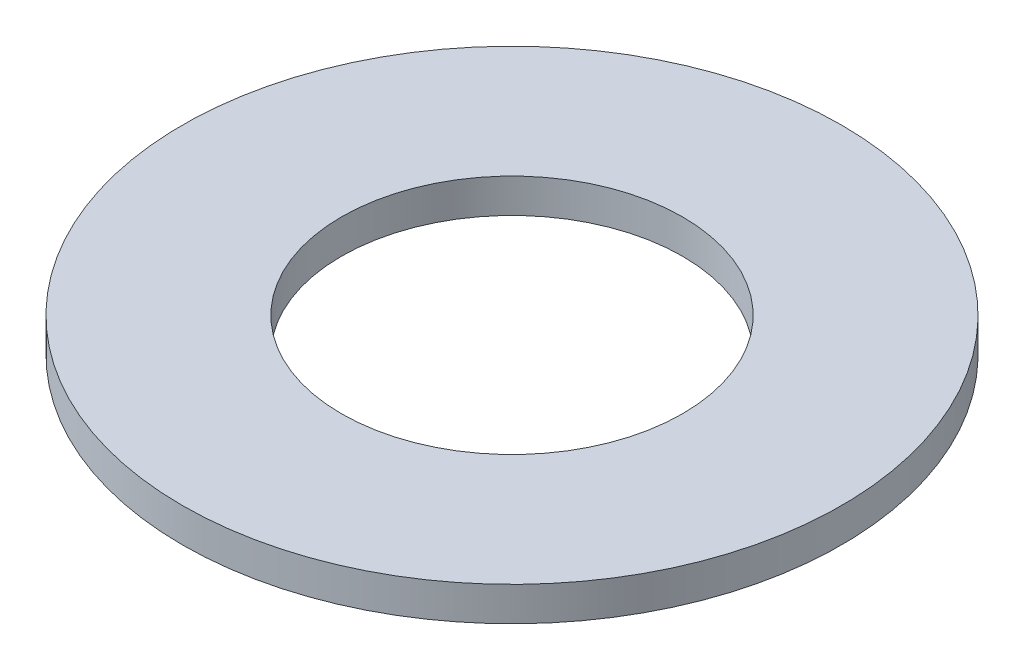
ISO-10303-21;
HEADER;
FILE_DESCRIPTION(('STEP AP214'),'2;1');
FILE_NAME('part.step','',(''),(''),'','','');
FILE_SCHEMA(('AUTOMOTIVE_DESIGN { 1 0 10303 214 1 1 1 1 }'));
ENDSEC;
DATA;
#1=APPLICATION_CONTEXT('core data for automotive mechanical design processes');
#2=APPLICATION_PROTOCOL_DEFINITION('international standard','automotive_design',2000,#1);
#3=PRODUCT_CONTEXT('',#1,'mechanical');
#4=PRODUCT('Part','Part','',(#3));
#5=PRODUCT_RELATED_PRODUCT_CATEGORY('part','',(#4));
#6=PRODUCT_DEFINITION_FORMATION('','',#4);
#7=PRODUCT_DEFINITION_CONTEXT('part definition',#1,'design');
#8=PRODUCT_DEFINITION('design','',#6,#7);
#9=PRODUCT_DEFINITION_SHAPE('','',#8);
#10=(LENGTH_UNIT() NAMED_UNIT(*) SI_UNIT(.MILLI.,.METRE.));
#11=(NAMED_UNIT(*) PLANE_ANGLE_UNIT() SI_UNIT($,.RADIAN.));
#12=(NAMED_UNIT(*) SI_UNIT($,.STERADIAN.) SOLID_ANGLE_UNIT());
#13=UNCERTAINTY_MEASURE_WITH_UNIT(LENGTH_MEASURE(1.E-05),#10,'distance_accuracy_value','');
#14=(GEOMETRIC_REPRESENTATION_CONTEXT(3) GLOBAL_UNCERTAINTY_ASSIGNED_CONTEXT((#13)) GLOBAL_UNIT_ASSIGNED_CONTEXT((#10,
#11,#12)) REPRESENTATION_CONTEXT('',''));
#15=CARTESIAN_POINT('',(0.,0.,0.));
#16=DIRECTION('',(0.,0.,1.));
#17=DIRECTION('',(1.,0.,0.));
#18=AXIS2_PLACEMENT_3D('',#15,#16,#17);
#19=CARTESIAN_POINT('',(0.,2.3,0.));
#20=DIRECTION('',(0.,1.,0.));
#21=DIRECTION('',(0.,0.,1.));
#22=AXIS2_PLACEMENT_3D('',#19,#20,#21);
#23=PLANE('',#22);
#24=CARTESIAN_POINT('',(0.,2.3,0.));
#25=DIRECTION('',(0.,1.,0.));
#26=DIRECTION('',(0.,0.,1.));
#27=AXIS2_PLACEMENT_3D('',#24,#25,#26);
#28=CIRCLE('',#27,22.21);
#29=CARTESIAN_POINT('',(0.,2.3,22.21));
#30=VERTEX_POINT('',#29);
#31=EDGE_CURVE('E10',#30,#30,#28,.T.);
#32=ORIENTED_EDGE('',*,*,#31,.T.);
#33=EDGE_LOOP('',(#32));
#34=FACE_BOUND('',#33,.T.);
#35=CARTESIAN_POINT('',(0.,2.3,0.));
#36=DIRECTION('',(0.,1.,0.));
#37=DIRECTION('',(0.,0.,1.));
#38=AXIS2_PLACEMENT_3D('',#35,#36,#37);
#39=CIRCLE('',#38,11.4935);
#40=CARTESIAN_POINT('',(0.,2.3,11.4935));
#41=VERTEX_POINT('',#40);
#42=EDGE_CURVE('E48',#41,#41,#39,.T.);
#43=ORIENTED_EDGE('',*,*,#42,.F.);
#44=EDGE_LOOP('',(#43));
#45=FACE_BOUND('',#44,.T.);
#46=ADVANCED_FACE('F37',(#34,#45),#23,.T.);
#47=CARTESIAN_POINT('',(0.,0.,0.));
#48=DIRECTION('',(0.,1.,0.));
#49=DIRECTION('',(0.,0.,1.));
#50=AXIS2_PLACEMENT_3D('',#47,#48,#49);
#51=PLANE('',#50);
#52=CARTESIAN_POINT('',(0.,0.,0.));
#53=DIRECTION('',(0.,1.,0.));
#54=DIRECTION('',(0.,0.,1.));
#55=AXIS2_PLACEMENT_3D('',#52,#53,#54);
#56=CIRCLE('',#55,22.21);
#57=CARTESIAN_POINT('',(0.,0.,22.21));
#58=VERTEX_POINT('',#57);
#59=EDGE_CURVE('E41',#58,#58,#56,.T.);
#60=ORIENTED_EDGE('',*,*,#59,.F.);
#61=EDGE_LOOP('',(#60));
#62=FACE_BOUND('',#61,.T.);
#63=CARTESIAN_POINT('',(0.,0.,0.));
#64=DIRECTION('',(0.,1.,0.));
#65=DIRECTION('',(0.,0.,1.));
#66=AXIS2_PLACEMENT_3D('',#63,#64,#65);
#67=CIRCLE('',#66,11.4935);
#68=CARTESIAN_POINT('',(0.,0.,11.4935));
#69=VERTEX_POINT('',#68);
#70=EDGE_CURVE('E50',#69,#69,#67,.T.);
#71=ORIENTED_EDGE('',*,*,#70,.T.);
#72=EDGE_LOOP('',(#71));
#73=FACE_BOUND('',#72,.T.);
#74=ADVANCED_FACE('F60',(#62,#73),#51,.F.);
#75=CARTESIAN_POINT('',(0.,2.3,0.));
#76=DIRECTION('',(0.,-1.,0.));
#77=DIRECTION('',(0.,0.,-1.));
#78=AXIS2_PLACEMENT_3D('',#75,#76,#77);
#79=CYLINDRICAL_SURFACE('',#78,22.21);
#80=ORIENTED_EDGE('',*,*,#31,.F.);
#81=EDGE_LOOP('',(#80));
#82=FACE_BOUND('',#81,.T.);
#83=ORIENTED_EDGE('',*,*,#59,.T.);
#84=EDGE_LOOP('',(#83));
#85=FACE_BOUND('',#84,.T.);
#86=ADVANCED_FACE('F39',(#82,#85),#79,.T.);
#87=CARTESIAN_POINT('',(0.,2.3,0.));
#88=DIRECTION('',(0.,-1.,0.));
#89=DIRECTION('',(0.,0.,-1.));
#90=AXIS2_PLACEMENT_3D('',#87,#88,#89);
#91=CYLINDRICAL_SURFACE('',#90,11.4935);
#92=ORIENTED_EDGE('',*,*,#42,.T.);
#93=EDGE_LOOP('',(#92));
#94=FACE_BOUND('',#93,.T.);
#95=ORIENTED_EDGE('',*,*,#70,.F.);
#96=EDGE_LOOP('',(#95));
#97=FACE_BOUND('',#96,.T.);
#98=ADVANCED_FACE('F56',(#94,#97),#91,.F.);
#99=CLOSED_SHELL('',(#46,#74,#86,#98));
#100=MANIFOLD_SOLID_BREP('B2',#99);
#101=ADVANCED_BREP_SHAPE_REPRESENTATION('',(#18,#100),#14);
#102=SHAPE_DEFINITION_REPRESENTATION(#9,#101);
ENDSEC;
END-ISO-10303-21;
